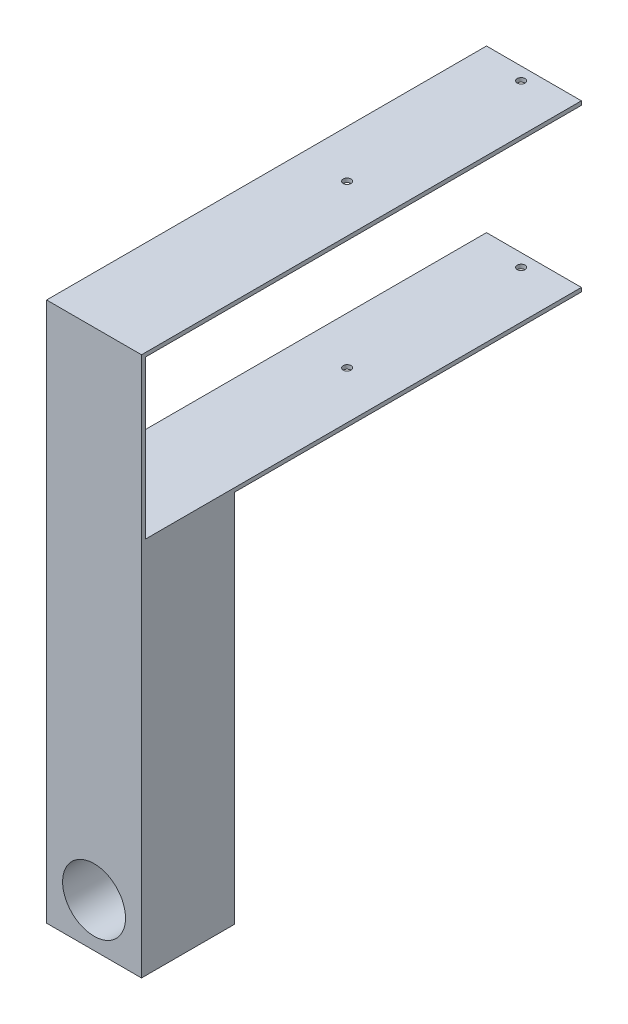
ISO-10303-21;
HEADER;
FILE_DESCRIPTION(('STEP AP214'),'2;1');
FILE_NAME('part.step','',(''),(''),'','','');
FILE_SCHEMA(('AUTOMOTIVE_DESIGN { 1 0 10303 214 1 1 1 1 }'));
ENDSEC;
DATA;
#1=APPLICATION_CONTEXT('core data for automotive mechanical design processes');
#2=APPLICATION_PROTOCOL_DEFINITION('international standard','automotive_design',2000,#1);
#3=PRODUCT_CONTEXT('',#1,'mechanical');
#4=PRODUCT('Part','Part','',(#3));
#5=PRODUCT_RELATED_PRODUCT_CATEGORY('part','',(#4));
#6=PRODUCT_DEFINITION_FORMATION('','',#4);
#7=PRODUCT_DEFINITION_CONTEXT('part definition',#1,'design');
#8=PRODUCT_DEFINITION('design','',#6,#7);
#9=PRODUCT_DEFINITION_SHAPE('','',#8);
#10=(LENGTH_UNIT() NAMED_UNIT(*) SI_UNIT(.MILLI.,.METRE.));
#11=(NAMED_UNIT(*) PLANE_ANGLE_UNIT() SI_UNIT($,.RADIAN.));
#12=(NAMED_UNIT(*) SI_UNIT($,.STERADIAN.) SOLID_ANGLE_UNIT());
#13=UNCERTAINTY_MEASURE_WITH_UNIT(LENGTH_MEASURE(1.E-05),#10,'distance_accuracy_value','');
#14=(GEOMETRIC_REPRESENTATION_CONTEXT(3) GLOBAL_UNCERTAINTY_ASSIGNED_CONTEXT((#13)) GLOBAL_UNIT_ASSIGNED_CONTEXT((#10,
#11,#12)) REPRESENTATION_CONTEXT('',''));
#15=CARTESIAN_POINT('',(0.,0.,0.));
#16=DIRECTION('',(0.,0.,1.));
#17=DIRECTION('',(1.,0.,0.));
#18=AXIS2_PLACEMENT_3D('',#15,#16,#17);
#19=CARTESIAN_POINT('',(5.25686301958173E-13,-1561.7523893499,-2296.02005437481));
#20=DIRECTION('',(0.,0.,-1.));
#21=DIRECTION('',(-1.,0.,0.));
#22=AXIS2_PLACEMENT_3D('',#19,#20,#21);
#23=PLANE('',#22);
#24=DIRECTION('',(1.,0.,0.));
#25=VECTOR('',#24,1.);
#26=CARTESIAN_POINT('',(-76.1999999999995,-1387.9123893499,-2296.02005437481));
#27=LINE('',#26,#25);
#28=CARTESIAN_POINT('',(-76.1999999999995,-1387.9123893499,-2296.02005437481));
#29=VERTEX_POINT('',#28);
#30=CARTESIAN_POINT('',(76.2000000000005,-1387.9123893499,-2296.02005437481));
#31=VERTEX_POINT('',#30);
#32=EDGE_CURVE('E154',#29,#31,#27,.T.);
#33=ORIENTED_EDGE('',*,*,#32,.F.);
#34=DIRECTION('',(0.,-1.,0.));
#35=VECTOR('',#34,1.);
#36=CARTESIAN_POINT('',(-76.1999999999995,-1995.1023893499,-2296.02005437481));
#37=LINE('',#36,#35);
#38=CARTESIAN_POINT('',(-76.1999999999995,-1134.7523893499,-2296.02005437481));
#39=VERTEX_POINT('',#38);
#40=EDGE_CURVE('E188',#39,#29,#37,.T.);
#41=ORIENTED_EDGE('',*,*,#40,.F.);
#42=DIRECTION('',(1.,0.,0.));
#43=VECTOR('',#42,1.);
#44=CARTESIAN_POINT('',(76.2000000000005,-1134.7523893499,-2296.02005437481));
#45=LINE('',#44,#43);
#46=CARTESIAN_POINT('',(76.2000000000005,-1134.7523893499,-2296.02005437481));
#47=VERTEX_POINT('',#46);
#48=EDGE_CURVE('E173',#39,#47,#45,.T.);
#49=ORIENTED_EDGE('',*,*,#48,.T.);
#50=DIRECTION('',(0.,1.,0.));
#51=VECTOR('',#50,1.);
#52=CARTESIAN_POINT('',(76.2000000000005,-1995.1023893499,-2296.02005437481));
#53=LINE('',#52,#51);
#54=EDGE_CURVE('E62',#31,#47,#53,.T.);
#55=ORIENTED_EDGE('',*,*,#54,.F.);
#56=EDGE_LOOP('',(#33,#41,#49,#55));
#57=FACE_BOUND('',#56,.T.);
#58=ADVANCED_FACE('F37',(#57),#23,.T.);
#59=CARTESIAN_POINT('',(76.2000000000005,-1995.1023893499,-2289.67005437481));
#60=DIRECTION('',(-1.,0.,0.));
#61=DIRECTION('',(0.,0.,1.));
#62=AXIS2_PLACEMENT_3D('',#59,#60,#61);
#63=PLANE('',#62);
#64=DIRECTION('',(0.,0.,-1.));
#65=VECTOR('',#64,1.);
#66=CARTESIAN_POINT('',(76.2000000000005,-1995.1023893499,-2289.67005437481));
#67=LINE('',#66,#65);
#68=CARTESIAN_POINT('',(76.2000000000005,-1995.1023893499,-2289.67005437481));
#69=VERTEX_POINT('',#68);
#70=CARTESIAN_POINT('',(76.2000000000005,-1995.1023893499,-2439.36059221998));
#71=VERTEX_POINT('',#70);
#72=EDGE_CURVE('E127',#69,#71,#67,.T.);
#73=ORIENTED_EDGE('',*,*,#72,.T.);
#74=DIRECTION('',(0.,1.,0.));
#75=VECTOR('',#74,1.);
#76=CARTESIAN_POINT('',(76.2000000000005,-1995.1023893499,-2439.36059221998));
#77=LINE('',#76,#75);
#78=CARTESIAN_POINT('',(76.2000000000005,-1394.2623893499,-2439.36059221998));
#79=VERTEX_POINT('',#78);
#80=EDGE_CURVE('E135',#71,#79,#77,.T.);
#81=ORIENTED_EDGE('',*,*,#80,.T.);
#82=DIRECTION('',(0.,0.,-1.));
#83=VECTOR('',#82,1.);
#84=CARTESIAN_POINT('',(76.2000000000005,-1394.2623893499,-2296.02005437481));
#85=LINE('',#84,#83);
#86=CARTESIAN_POINT('',(76.2000000000005,-1394.2623893499,-2996.02005437481));
#87=VERTEX_POINT('',#86);
#88=EDGE_CURVE('E146',#79,#87,#85,.T.);
#89=ORIENTED_EDGE('',*,*,#88,.T.);
#90=DIRECTION('',(0.,1.,0.));
#91=VECTOR('',#90,1.);
#92=CARTESIAN_POINT('',(76.2000000000005,-1394.2623893499,-2996.02005437481));
#93=LINE('',#92,#91);
#94=CARTESIAN_POINT('',(76.2000000000005,-1387.9123893499,-2996.02005437481));
#95=VERTEX_POINT('',#94);
#96=EDGE_CURVE('E152',#87,#95,#93,.T.);
#97=ORIENTED_EDGE('',*,*,#96,.T.);
#98=DIRECTION('',(0.,0.,-1.));
#99=VECTOR('',#98,1.);
#100=CARTESIAN_POINT('',(76.2000000000005,-1387.9123893499,-2296.02005437481));
#101=LINE('',#100,#99);
#102=EDGE_CURVE('E157',#31,#95,#101,.T.);
#103=ORIENTED_EDGE('',*,*,#102,.F.);
#104=ORIENTED_EDGE('',*,*,#54,.T.);
#105=DIRECTION('',(0.,0.,-1.));
#106=VECTOR('',#105,1.);
#107=CARTESIAN_POINT('',(76.2000000000005,-1134.7523893499,-2296.02005437481));
#108=LINE('',#107,#106);
#109=CARTESIAN_POINT('',(76.2000000000005,-1134.7523893499,-2996.02005437481));
#110=VERTEX_POINT('',#109);
#111=EDGE_CURVE('E166',#47,#110,#108,.T.);
#112=ORIENTED_EDGE('',*,*,#111,.T.);
#113=DIRECTION('',(0.,1.,0.));
#114=VECTOR('',#113,1.);
#115=CARTESIAN_POINT('',(76.2000000000005,-1134.7523893499,-2996.02005437481));
#116=LINE('',#115,#114);
#117=CARTESIAN_POINT('',(76.2000000000005,-1128.4023893499,-2996.02005437481));
#118=VERTEX_POINT('',#117);
#119=EDGE_CURVE('E176',#110,#118,#116,.T.);
#120=ORIENTED_EDGE('',*,*,#119,.T.);
#121=DIRECTION('',(0.,0.,-1.));
#122=VECTOR('',#121,1.);
#123=CARTESIAN_POINT('',(76.2000000000005,-1128.4023893499,-2289.67005437481));
#124=LINE('',#123,#122);
#125=CARTESIAN_POINT('',(76.2000000000005,-1128.4023893499,-2289.67005437481));
#126=VERTEX_POINT('',#125);
#127=EDGE_CURVE('E11',#126,#118,#124,.T.);
#128=ORIENTED_EDGE('',*,*,#127,.F.);
#129=DIRECTION('',(0.,1.,0.));
#130=VECTOR('',#129,1.);
#131=CARTESIAN_POINT('',(76.2000000000005,-1995.1023893499,-2289.67005437481));
#132=LINE('',#131,#130);
#133=EDGE_CURVE('E184',#69,#126,#132,.T.);
#134=ORIENTED_EDGE('',*,*,#133,.F.);
#135=EDGE_LOOP('',(#73,#81,#89,#97,#103,#104,#112,#120,#128,#134));
#136=FACE_BOUND('',#135,.T.);
#137=ADVANCED_FACE('F39',(#136),#63,.F.);
#138=CARTESIAN_POINT('',(-76.1999999999995,-1128.4023893499,-2289.67005437481));
#139=DIRECTION('',(0.,-1.,0.));
#140=DIRECTION('',(0.,0.,-1.));
#141=AXIS2_PLACEMENT_3D('',#138,#139,#140);
#142=PLANE('',#141);
#143=CARTESIAN_POINT('',(5.25686301958173E-13,-1128.4023893499,-2975.47005437481));
#144=DIRECTION('',(0.,1.,0.));
#145=DIRECTION('',(0.,0.,1.));
#146=AXIS2_PLACEMENT_3D('',#143,#144,#145);
#147=CIRCLE('',#146,6.34999999999998);
#148=CARTESIAN_POINT('',(5.25686301958173E-13,-1128.4023893499,-2969.12005437481));
#149=VERTEX_POINT('',#148);
#150=EDGE_CURVE('E201',#149,#149,#147,.T.);
#151=ORIENTED_EDGE('',*,*,#150,.F.);
#152=EDGE_LOOP('',(#151));
#153=FACE_BOUND('',#152,.T.);
#154=CARTESIAN_POINT('',(5.25686301958173E-13,-1128.4023893499,-2696.07005437481));
#155=DIRECTION('',(0.,1.,0.));
#156=DIRECTION('',(0.,0.,1.));
#157=AXIS2_PLACEMENT_3D('',#154,#155,#156);
#158=CIRCLE('',#157,6.34999999999998);
#159=CARTESIAN_POINT('',(5.25686301958173E-13,-1128.4023893499,-2689.72005437481));
#160=VERTEX_POINT('',#159);
#161=EDGE_CURVE('E216',#160,#160,#158,.T.);
#162=ORIENTED_EDGE('',*,*,#161,.F.);
#163=EDGE_LOOP('',(#162));
#164=FACE_BOUND('',#163,.T.);
#165=ORIENTED_EDGE('',*,*,#127,.T.);
#166=DIRECTION('',(-1.,0.,0.));
#167=VECTOR('',#166,1.);
#168=CARTESIAN_POINT('',(76.2000000000005,-1128.4023893499,-2996.02005437481));
#169=LINE('',#168,#167);
#170=CARTESIAN_POINT('',(-76.1999999999995,-1128.4023893499,-2996.02005437481));
#171=VERTEX_POINT('',#170);
#172=EDGE_CURVE('E164',#118,#171,#169,.T.);
#173=ORIENTED_EDGE('',*,*,#172,.T.);
#174=DIRECTION('',(0.,0.,-1.));
#175=VECTOR('',#174,1.);
#176=CARTESIAN_POINT('',(-76.1999999999995,-1128.4023893499,-2289.67005437481));
#177=LINE('',#176,#175);
#178=CARTESIAN_POINT('',(-76.1999999999995,-1128.4023893499,-2289.67005437481));
#179=VERTEX_POINT('',#178);
#180=EDGE_CURVE('E46',#179,#171,#177,.T.);
#181=ORIENTED_EDGE('',*,*,#180,.F.);
#182=DIRECTION('',(-1.,0.,0.));
#183=VECTOR('',#182,1.);
#184=CARTESIAN_POINT('',(-76.1999999999995,-1128.4023893499,-2289.67005437481));
#185=LINE('',#184,#183);
#186=EDGE_CURVE('E187',#126,#179,#185,.T.);
#187=ORIENTED_EDGE('',*,*,#186,.F.);
#188=EDGE_LOOP('',(#165,#173,#181,#187));
#189=FACE_BOUND('',#188,.T.);
#190=ADVANCED_FACE('F252',(#153,#164,#189),#142,.F.);
#191=CARTESIAN_POINT('',(-76.1999999999995,-1995.1023893499,-2289.67005437481));
#192=DIRECTION('',(1.,0.,0.));
#193=DIRECTION('',(0.,0.,-1.));
#194=AXIS2_PLACEMENT_3D('',#191,#192,#193);
#195=PLANE('',#194);
#196=DIRECTION('',(0.,1.,0.));
#197=VECTOR('',#196,1.);
#198=CARTESIAN_POINT('',(-76.1999999999995,-1995.1023893499,-2439.36059221998));
#199=LINE('',#198,#197);
#200=CARTESIAN_POINT('',(-76.1999999999995,-1995.1023893499,-2439.36059221998));
#201=VERTEX_POINT('',#200);
#202=CARTESIAN_POINT('',(-76.1999999999995,-1394.2623893499,-2439.36059221998));
#203=VERTEX_POINT('',#202);
#204=EDGE_CURVE('E130',#201,#203,#199,.T.);
#205=ORIENTED_EDGE('',*,*,#204,.F.);
#206=DIRECTION('',(0.,0.,-1.));
#207=VECTOR('',#206,1.);
#208=CARTESIAN_POINT('',(-76.1999999999995,-1995.1023893499,-2289.67005437481));
#209=LINE('',#208,#207);
#210=CARTESIAN_POINT('',(-76.1999999999995,-1995.1023893499,-2289.67005437481));
#211=VERTEX_POINT('',#210);
#212=EDGE_CURVE('E118',#211,#201,#209,.T.);
#213=ORIENTED_EDGE('',*,*,#212,.F.);
#214=DIRECTION('',(0.,-1.,0.));
#215=VECTOR('',#214,1.);
#216=CARTESIAN_POINT('',(-76.1999999999995,-1995.1023893499,-2289.67005437481));
#217=LINE('',#216,#215);
#218=EDGE_CURVE('E190',#179,#211,#217,.T.);
#219=ORIENTED_EDGE('',*,*,#218,.F.);
#220=ORIENTED_EDGE('',*,*,#180,.T.);
#221=DIRECTION('',(0.,1.,0.));
#222=VECTOR('',#221,1.);
#223=CARTESIAN_POINT('',(-76.1999999999995,-1134.7523893499,-2996.02005437481));
#224=LINE('',#223,#222);
#225=CARTESIAN_POINT('',(-76.1999999999995,-1134.7523893499,-2996.02005437481));
#226=VERTEX_POINT('',#225);
#227=EDGE_CURVE('E179',#226,#171,#224,.T.);
#228=ORIENTED_EDGE('',*,*,#227,.F.);
#229=DIRECTION('',(0.,0.,1.));
#230=VECTOR('',#229,1.);
#231=CARTESIAN_POINT('',(-76.1999999999995,-1134.7523893499,-2296.02005437481));
#232=LINE('',#231,#230);
#233=EDGE_CURVE('E171',#226,#39,#232,.T.);
#234=ORIENTED_EDGE('',*,*,#233,.T.);
#235=ORIENTED_EDGE('',*,*,#40,.T.);
#236=DIRECTION('',(0.,0.,1.));
#237=VECTOR('',#236,1.);
#238=CARTESIAN_POINT('',(-76.1999999999995,-1387.9123893499,-2296.02005437481));
#239=LINE('',#238,#237);
#240=CARTESIAN_POINT('',(-76.1999999999995,-1387.9123893499,-2996.02005437481));
#241=VERTEX_POINT('',#240);
#242=EDGE_CURVE('E134',#241,#29,#239,.T.);
#243=ORIENTED_EDGE('',*,*,#242,.F.);
#244=DIRECTION('',(0.,1.,0.));
#245=VECTOR('',#244,1.);
#246=CARTESIAN_POINT('',(-76.1999999999995,-1394.2623893499,-2996.02005437481));
#247=LINE('',#246,#245);
#248=CARTESIAN_POINT('',(-76.1999999999995,-1394.2623893499,-2996.02005437481));
#249=VERTEX_POINT('',#248);
#250=EDGE_CURVE('E162',#249,#241,#247,.T.);
#251=ORIENTED_EDGE('',*,*,#250,.F.);
#252=DIRECTION('',(0.,0.,1.));
#253=VECTOR('',#252,1.);
#254=CARTESIAN_POINT('',(-76.1999999999995,-1394.2623893499,-2296.02005437481));
#255=LINE('',#254,#253);
#256=EDGE_CURVE('E133',#249,#203,#255,.T.);
#257=ORIENTED_EDGE('',*,*,#256,.T.);
#258=EDGE_LOOP('',(#205,#213,#219,#220,#228,#234,#235,#243,#251,#257));
#259=FACE_BOUND('',#258,.T.);
#260=ADVANCED_FACE('F131',(#259),#195,.F.);
#261=CARTESIAN_POINT('',(-76.1999999999995,-1995.1023893499,-2289.67005437481));
#262=DIRECTION('',(0.,1.,0.));
#263=DIRECTION('',(0.,0.,1.));
#264=AXIS2_PLACEMENT_3D('',#261,#262,#263);
#265=PLANE('',#264);
#266=DIRECTION('',(-1.,0.,0.));
#267=VECTOR('',#266,1.);
#268=CARTESIAN_POINT('',(76.2000000000005,-1995.1023893499,-2439.36059221998));
#269=LINE('',#268,#267);
#270=EDGE_CURVE('E123',#71,#201,#269,.T.);
#271=ORIENTED_EDGE('',*,*,#270,.F.);
#272=ORIENTED_EDGE('',*,*,#72,.F.);
#273=DIRECTION('',(1.,0.,0.));
#274=VECTOR('',#273,1.);
#275=CARTESIAN_POINT('',(-76.1999999999995,-1995.1023893499,-2289.67005437481));
#276=LINE('',#275,#274);
#277=EDGE_CURVE('E124',#211,#69,#276,.T.);
#278=ORIENTED_EDGE('',*,*,#277,.F.);
#279=ORIENTED_EDGE('',*,*,#212,.T.);
#280=EDGE_LOOP('',(#271,#272,#278,#279));
#281=FACE_BOUND('',#280,.T.);
#282=ADVANCED_FACE('F120',(#281),#265,.F.);
#283=CARTESIAN_POINT('',(5.25686301958173E-13,-1561.7523893499,-2289.67005437481));
#284=DIRECTION('',(0.,0.,-1.));
#285=DIRECTION('',(-1.,0.,0.));
#286=AXIS2_PLACEMENT_3D('',#283,#284,#285);
#287=PLANE('',#286);
#288=CARTESIAN_POINT('',(5.25686301958173E-13,-1924.6023893499,-2289.67005437481));
#289=DIRECTION('',(0.,0.,1.));
#290=DIRECTION('',(1.,0.,0.));
#291=AXIS2_PLACEMENT_3D('',#288,#289,#290);
#292=CIRCLE('',#291,50.5);
#293=CARTESIAN_POINT('',(50.5000000000005,-1924.6023893499,-2289.67005437481));
#294=VERTEX_POINT('',#293);
#295=EDGE_CURVE('E221',#294,#294,#292,.T.);
#296=ORIENTED_EDGE('',*,*,#295,.F.);
#297=EDGE_LOOP('',(#296));
#298=FACE_BOUND('',#297,.T.);
#299=ORIENTED_EDGE('',*,*,#133,.T.);
#300=ORIENTED_EDGE('',*,*,#186,.T.);
#301=ORIENTED_EDGE('',*,*,#218,.T.);
#302=ORIENTED_EDGE('',*,*,#277,.T.);
#303=EDGE_LOOP('',(#299,#300,#301,#302));
#304=FACE_BOUND('',#303,.T.);
#305=ADVANCED_FACE('F256',(#298,#304),#287,.F.);
#306=CARTESIAN_POINT('',(76.2000000000005,-1134.7523893499,-2996.02005437481));
#307=DIRECTION('',(0.,0.,-1.));
#308=DIRECTION('',(-1.,0.,0.));
#309=AXIS2_PLACEMENT_3D('',#306,#307,#308);
#310=PLANE('',#309);
#311=ORIENTED_EDGE('',*,*,#172,.F.);
#312=ORIENTED_EDGE('',*,*,#119,.F.);
#313=DIRECTION('',(-1.,0.,0.));
#314=VECTOR('',#313,1.);
#315=CARTESIAN_POINT('',(76.2000000000005,-1134.7523893499,-2996.02005437481));
#316=LINE('',#315,#314);
#317=EDGE_CURVE('E168',#110,#226,#316,.T.);
#318=ORIENTED_EDGE('',*,*,#317,.T.);
#319=ORIENTED_EDGE('',*,*,#227,.T.);
#320=EDGE_LOOP('',(#311,#312,#318,#319));
#321=FACE_BOUND('',#320,.T.);
#322=ADVANCED_FACE('F275',(#321),#310,.T.);
#323=CARTESIAN_POINT('',(5.25686301958173E-13,-1134.7523893499,-2296.02005437481));
#324=DIRECTION('',(0.,1.,0.));
#325=DIRECTION('',(0.,0.,1.));
#326=AXIS2_PLACEMENT_3D('',#323,#324,#325);
#327=PLANE('',#326);
#328=CARTESIAN_POINT('',(5.25686301958173E-13,-1134.7523893499,-2975.47005437481));
#329=DIRECTION('',(0.,1.,0.));
#330=DIRECTION('',(0.,0.,1.));
#331=AXIS2_PLACEMENT_3D('',#328,#329,#330);
#332=CIRCLE('',#331,6.34999999999998);
#333=CARTESIAN_POINT('',(5.25686301958173E-13,-1134.7523893499,-2969.12005437481));
#334=VERTEX_POINT('',#333);
#335=EDGE_CURVE('E140',#334,#334,#332,.T.);
#336=ORIENTED_EDGE('',*,*,#335,.T.);
#337=EDGE_LOOP('',(#336));
#338=FACE_BOUND('',#337,.T.);
#339=CARTESIAN_POINT('',(5.25686301958173E-13,-1134.7523893499,-2696.07005437481));
#340=DIRECTION('',(0.,1.,0.));
#341=DIRECTION('',(0.,0.,1.));
#342=AXIS2_PLACEMENT_3D('',#339,#340,#341);
#343=CIRCLE('',#342,6.34999999999998);
#344=CARTESIAN_POINT('',(5.25686301958173E-13,-1134.7523893499,-2689.72005437481));
#345=VERTEX_POINT('',#344);
#346=EDGE_CURVE('E205',#345,#345,#343,.T.);
#347=ORIENTED_EDGE('',*,*,#346,.T.);
#348=EDGE_LOOP('',(#347));
#349=FACE_BOUND('',#348,.T.);
#350=ORIENTED_EDGE('',*,*,#111,.F.);
#351=ORIENTED_EDGE('',*,*,#48,.F.);
#352=ORIENTED_EDGE('',*,*,#233,.F.);
#353=ORIENTED_EDGE('',*,*,#317,.F.);
#354=EDGE_LOOP('',(#350,#351,#352,#353));
#355=FACE_BOUND('',#354,.T.);
#356=ADVANCED_FACE('F279',(#338,#349,#355),#327,.F.);
#357=CARTESIAN_POINT('',(76.2000000000005,-1394.2623893499,-2996.02005437481));
#358=DIRECTION('',(0.,0.,-1.));
#359=DIRECTION('',(-1.,0.,0.));
#360=AXIS2_PLACEMENT_3D('',#357,#358,#359);
#361=PLANE('',#360);
#362=DIRECTION('',(-1.,0.,0.));
#363=VECTOR('',#362,1.);
#364=CARTESIAN_POINT('',(76.2000000000005,-1387.9123893499,-2996.02005437481));
#365=LINE('',#364,#363);
#366=EDGE_CURVE('E147',#95,#241,#365,.T.);
#367=ORIENTED_EDGE('',*,*,#366,.F.);
#368=ORIENTED_EDGE('',*,*,#96,.F.);
#369=DIRECTION('',(-1.,0.,0.));
#370=VECTOR('',#369,1.);
#371=CARTESIAN_POINT('',(76.2000000000005,-1394.2623893499,-2996.02005437481));
#372=LINE('',#371,#370);
#373=EDGE_CURVE('E149',#87,#249,#372,.T.);
#374=ORIENTED_EDGE('',*,*,#373,.T.);
#375=ORIENTED_EDGE('',*,*,#250,.T.);
#376=EDGE_LOOP('',(#367,#368,#374,#375));
#377=FACE_BOUND('',#376,.T.);
#378=ADVANCED_FACE('F286',(#377),#361,.T.);
#379=CARTESIAN_POINT('',(5.25686301958173E-13,-1394.2623893499,-2296.02005437481));
#380=DIRECTION('',(0.,1.,0.));
#381=DIRECTION('',(0.,0.,1.));
#382=AXIS2_PLACEMENT_3D('',#379,#380,#381);
#383=PLANE('',#382);
#384=CARTESIAN_POINT('',(5.25686301958173E-13,-1394.2623893499,-2975.47005437481));
#385=DIRECTION('',(0.,1.,0.));
#386=DIRECTION('',(0.,0.,1.));
#387=AXIS2_PLACEMENT_3D('',#384,#385,#386);
#388=CIRCLE('',#387,6.34999999999998);
#389=CARTESIAN_POINT('',(5.25686301958173E-13,-1394.2623893499,-2969.12005437481));
#390=VERTEX_POINT('',#389);
#391=EDGE_CURVE('E204',#390,#390,#388,.T.);
#392=ORIENTED_EDGE('',*,*,#391,.T.);
#393=EDGE_LOOP('',(#392));
#394=FACE_BOUND('',#393,.T.);
#395=CARTESIAN_POINT('',(5.25686301958173E-13,-1394.2623893499,-2696.07005437481));
#396=DIRECTION('',(0.,1.,0.));
#397=DIRECTION('',(0.,0.,1.));
#398=AXIS2_PLACEMENT_3D('',#395,#396,#397);
#399=CIRCLE('',#398,6.34999999999998);
#400=CARTESIAN_POINT('',(5.25686301958173E-13,-1394.2623893499,-2689.72005437481));
#401=VERTEX_POINT('',#400);
#402=EDGE_CURVE('E200',#401,#401,#399,.T.);
#403=ORIENTED_EDGE('',*,*,#402,.T.);
#404=EDGE_LOOP('',(#403));
#405=FACE_BOUND('',#404,.T.);
#406=ORIENTED_EDGE('',*,*,#88,.F.);
#407=DIRECTION('',(-1.,0.,0.));
#408=VECTOR('',#407,1.);
#409=CARTESIAN_POINT('',(76.2000000000005,-1394.2623893499,-2439.36059221998));
#410=LINE('',#409,#408);
#411=EDGE_CURVE('E54',#79,#203,#410,.T.);
#412=ORIENTED_EDGE('',*,*,#411,.T.);
#413=ORIENTED_EDGE('',*,*,#256,.F.);
#414=ORIENTED_EDGE('',*,*,#373,.F.);
#415=EDGE_LOOP('',(#406,#412,#413,#414));
#416=FACE_BOUND('',#415,.T.);
#417=ADVANCED_FACE('F242',(#394,#405,#416),#383,.F.);
#418=CARTESIAN_POINT('',(5.25686301958173E-13,-1387.9123893499,-2296.02005437481));
#419=DIRECTION('',(0.,1.,0.));
#420=DIRECTION('',(0.,0.,1.));
#421=AXIS2_PLACEMENT_3D('',#418,#419,#420);
#422=PLANE('',#421);
#423=CARTESIAN_POINT('',(5.25686301958173E-13,-1387.9123893499,-2975.47005437481));
#424=DIRECTION('',(0.,1.,0.));
#425=DIRECTION('',(0.,0.,1.));
#426=AXIS2_PLACEMENT_3D('',#423,#424,#425);
#427=CIRCLE('',#426,6.34999999999998);
#428=CARTESIAN_POINT('',(5.25686301958173E-13,-1387.9123893499,-2969.12005437481));
#429=VERTEX_POINT('',#428);
#430=EDGE_CURVE('E202',#429,#429,#427,.T.);
#431=ORIENTED_EDGE('',*,*,#430,.F.);
#432=EDGE_LOOP('',(#431));
#433=FACE_BOUND('',#432,.T.);
#434=CARTESIAN_POINT('',(5.25686301958173E-13,-1387.9123893499,-2696.07005437481));
#435=DIRECTION('',(0.,1.,0.));
#436=DIRECTION('',(0.,0.,1.));
#437=AXIS2_PLACEMENT_3D('',#434,#435,#436);
#438=CIRCLE('',#437,6.34999999999998);
#439=CARTESIAN_POINT('',(5.25686301958173E-13,-1387.9123893499,-2689.72005437481));
#440=VERTEX_POINT('',#439);
#441=EDGE_CURVE('E198',#440,#440,#438,.T.);
#442=ORIENTED_EDGE('',*,*,#441,.F.);
#443=EDGE_LOOP('',(#442));
#444=FACE_BOUND('',#443,.T.);
#445=ORIENTED_EDGE('',*,*,#242,.T.);
#446=ORIENTED_EDGE('',*,*,#32,.T.);
#447=ORIENTED_EDGE('',*,*,#102,.T.);
#448=ORIENTED_EDGE('',*,*,#366,.T.);
#449=EDGE_LOOP('',(#445,#446,#447,#448));
#450=FACE_BOUND('',#449,.T.);
#451=ADVANCED_FACE('F232',(#433,#444,#450),#422,.T.);
#452=CARTESIAN_POINT('',(76.2000000000005,-1995.1023893499,-2439.36059221998));
#453=DIRECTION('',(0.,0.,-1.));
#454=DIRECTION('',(-1.,0.,0.));
#455=AXIS2_PLACEMENT_3D('',#452,#453,#454);
#456=PLANE('',#455);
#457=CARTESIAN_POINT('',(5.25686301958173E-13,-1924.6023893499,-2439.36059221998));
#458=DIRECTION('',(0.,0.,-1.));
#459=DIRECTION('',(-1.,0.,0.));
#460=AXIS2_PLACEMENT_3D('',#457,#458,#459);
#461=CIRCLE('',#460,50.5);
#462=CARTESIAN_POINT('',(-50.4999999999995,-1924.6023893499,-2439.36059221998));
#463=VERTEX_POINT('',#462);
#464=EDGE_CURVE('E41',#463,#463,#461,.T.);
#465=ORIENTED_EDGE('',*,*,#464,.F.);
#466=EDGE_LOOP('',(#465));
#467=FACE_BOUND('',#466,.T.);
#468=ORIENTED_EDGE('',*,*,#411,.F.);
#469=ORIENTED_EDGE('',*,*,#80,.F.);
#470=ORIENTED_EDGE('',*,*,#270,.T.);
#471=ORIENTED_EDGE('',*,*,#204,.T.);
#472=EDGE_LOOP('',(#468,#469,#470,#471));
#473=FACE_BOUND('',#472,.T.);
#474=ADVANCED_FACE('F137',(#467,#473),#456,.T.);
#475=CARTESIAN_POINT('',(5.25686301958173E-13,-1634.2623893499,-2696.07005437481));
#476=DIRECTION('',(0.,1.,0.));
#477=DIRECTION('',(0.,0.,1.));
#478=AXIS2_PLACEMENT_3D('',#475,#476,#477);
#479=CYLINDRICAL_SURFACE('',#478,6.34999999999998);
#480=ORIENTED_EDGE('',*,*,#441,.T.);
#481=EDGE_LOOP('',(#480));
#482=FACE_BOUND('',#481,.T.);
#483=ORIENTED_EDGE('',*,*,#402,.F.);
#484=EDGE_LOOP('',(#483));
#485=FACE_BOUND('',#484,.T.);
#486=ADVANCED_FACE('F231',(#482,#485),#479,.F.);
#487=CARTESIAN_POINT('',(5.25686301958173E-13,-1634.2623893499,-2975.47005437481));
#488=DIRECTION('',(0.,1.,0.));
#489=DIRECTION('',(0.,0.,1.));
#490=AXIS2_PLACEMENT_3D('',#487,#488,#489);
#491=CYLINDRICAL_SURFACE('',#490,6.34999999999998);
#492=ORIENTED_EDGE('',*,*,#430,.T.);
#493=EDGE_LOOP('',(#492));
#494=FACE_BOUND('',#493,.T.);
#495=ORIENTED_EDGE('',*,*,#391,.F.);
#496=EDGE_LOOP('',(#495));
#497=FACE_BOUND('',#496,.T.);
#498=ADVANCED_FACE('F238',(#494,#497),#491,.F.);
#499=ORIENTED_EDGE('',*,*,#161,.T.);
#500=EDGE_LOOP('',(#499));
#501=FACE_BOUND('',#500,.T.);
#502=ORIENTED_EDGE('',*,*,#346,.F.);
#503=EDGE_LOOP('',(#502));
#504=FACE_BOUND('',#503,.T.);
#505=ADVANCED_FACE('F241',(#501,#504),#479,.F.);
#506=ORIENTED_EDGE('',*,*,#150,.T.);
#507=EDGE_LOOP('',(#506));
#508=FACE_BOUND('',#507,.T.);
#509=ORIENTED_EDGE('',*,*,#335,.F.);
#510=EDGE_LOOP('',(#509));
#511=FACE_BOUND('',#510,.T.);
#512=ADVANCED_FACE('F314',(#508,#511),#491,.F.);
#513=CARTESIAN_POINT('',(5.25686301958173E-13,-1924.6023893499,-2996.02005437481));
#514=DIRECTION('',(0.,0.,1.));
#515=DIRECTION('',(1.,0.,0.));
#516=AXIS2_PLACEMENT_3D('',#513,#514,#515);
#517=CYLINDRICAL_SURFACE('',#516,50.5);
#518=ORIENTED_EDGE('',*,*,#464,.T.);
#519=EDGE_LOOP('',(#518));
#520=FACE_BOUND('',#519,.T.);
#521=ORIENTED_EDGE('',*,*,#295,.T.);
#522=EDGE_LOOP('',(#521));
#523=FACE_BOUND('',#522,.T.);
#524=ADVANCED_FACE('F228',(#520,#523),#517,.F.);
#525=CLOSED_SHELL('',(#58,#137,#190,#260,#282,#305,#322,#356,#378,#417,#451,#474,#486,#498,#505,
#512,#524));
#526=MANIFOLD_SOLID_BREP('B2',#525);
#527=ADVANCED_BREP_SHAPE_REPRESENTATION('',(#18,#526),#14);
#528=SHAPE_DEFINITION_REPRESENTATION(#9,#527);
ENDSEC;
END-ISO-10303-21;
